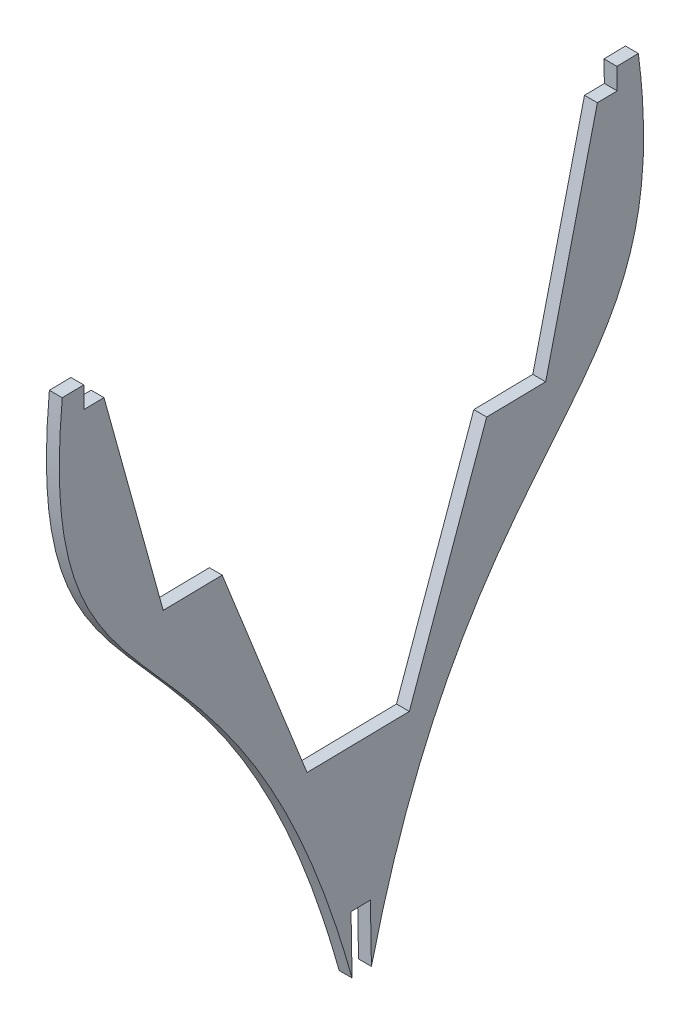
ISO-10303-21;
HEADER;
FILE_DESCRIPTION(('STEP AP214'),'2;1');
FILE_NAME('part.step','',(''),(''),'','','');
FILE_SCHEMA(('AUTOMOTIVE_DESIGN { 1 0 10303 214 1 1 1 1 }'));
ENDSEC;
DATA;
#1=APPLICATION_CONTEXT('core data for automotive mechanical design processes');
#2=APPLICATION_PROTOCOL_DEFINITION('international standard','automotive_design',2000,#1);
#3=PRODUCT_CONTEXT('',#1,'mechanical');
#4=PRODUCT('Part','Part','',(#3));
#5=PRODUCT_RELATED_PRODUCT_CATEGORY('part','',(#4));
#6=PRODUCT_DEFINITION_FORMATION('','',#4);
#7=PRODUCT_DEFINITION_CONTEXT('part definition',#1,'design');
#8=PRODUCT_DEFINITION('design','',#6,#7);
#9=PRODUCT_DEFINITION_SHAPE('','',#8);
#10=(LENGTH_UNIT() NAMED_UNIT(*) SI_UNIT(.MILLI.,.METRE.));
#11=(NAMED_UNIT(*) PLANE_ANGLE_UNIT() SI_UNIT($,.RADIAN.));
#12=(NAMED_UNIT(*) SI_UNIT($,.STERADIAN.) SOLID_ANGLE_UNIT());
#13=UNCERTAINTY_MEASURE_WITH_UNIT(LENGTH_MEASURE(1.E-05),#10,'distance_accuracy_value','');
#14=(GEOMETRIC_REPRESENTATION_CONTEXT(3) GLOBAL_UNCERTAINTY_ASSIGNED_CONTEXT((#13)) GLOBAL_UNIT_ASSIGNED_CONTEXT((#10,
#11,#12)) REPRESENTATION_CONTEXT('',''));
#15=CARTESIAN_POINT('',(0.,0.,0.));
#16=DIRECTION('',(0.,0.,1.));
#17=DIRECTION('',(1.,0.,0.));
#18=AXIS2_PLACEMENT_3D('',#15,#16,#17);
#19=CARTESIAN_POINT('',(6.,360.566258287596,140.41667905477));
#20=CARTESIAN_POINT('',(6.,210.618365196739,154.662503450058));
#21=CARTESIAN_POINT('',(6.,259.198688035919,55.3330933592339));
#22=CARTESIAN_POINT('',(6.,41.0750381859938,0.720131580229417));
#23=B_SPLINE_CURVE_WITH_KNOTS('',3,(#19,#20,#21,#22),.UNSPECIFIED.,.F.,.F.,(4,4),(0.,1.),.UNSPECIFIED.);
#24=DIRECTION('',(-1.,0.,0.));
#25=VECTOR('',#24,1.);
#26=SURFACE_OF_LINEAR_EXTRUSION('',#23,#25);
#27=CARTESIAN_POINT('',(0.,360.566258287596,140.41667905477));
#28=CARTESIAN_POINT('',(0.,210.618365196739,154.662503450058));
#29=CARTESIAN_POINT('',(0.,259.198688035919,55.3330933592339));
#30=CARTESIAN_POINT('',(0.,41.0750381859938,0.720131580229417));
#31=B_SPLINE_CURVE_WITH_KNOTS('',3,(#27,#28,#29,#30),.UNSPECIFIED.,.F.,.F.,(4,4),(0.,1.),.UNSPECIFIED.);
#32=CARTESIAN_POINT('',(0.,360.566258287596,140.41667905477));
#33=VERTEX_POINT('',#32);
#34=CARTESIAN_POINT('',(0.,59.246755687746,5.54010309085406));
#35=VERTEX_POINT('',#34);
#36=EDGE_CURVE('E179',#33,#35,#31,.T.);
#37=ORIENTED_EDGE('',*,*,#36,.T.);
#38=DIRECTION('',(1.,0.,0.));
#39=VECTOR('',#38,1.);
#40=CARTESIAN_POINT('',(0.,59.246755687746,5.54010309085406));
#41=LINE('',#40,#39);
#42=CARTESIAN_POINT('',(6.,59.246755687746,5.54010309085406));
#43=VERTEX_POINT('',#42);
#44=EDGE_CURVE('E185',#35,#43,#41,.T.);
#45=ORIENTED_EDGE('',*,*,#44,.T.);
#46=CARTESIAN_POINT('',(6.,360.566258287596,140.41667905477));
#47=VERTEX_POINT('',#46);
#48=EDGE_CURVE('E219',#47,#43,#23,.T.);
#49=ORIENTED_EDGE('',*,*,#48,.F.);
#50=DIRECTION('',(-1.,0.,0.));
#51=VECTOR('',#50,1.);
#52=CARTESIAN_POINT('',(6.,360.566258287596,140.41667905477));
#53=LINE('',#52,#51);
#54=EDGE_CURVE('E175',#47,#33,#53,.T.);
#55=ORIENTED_EDGE('',*,*,#54,.T.);
#56=EDGE_LOOP('',(#37,#45,#49,#55));
#57=FACE_BOUND('',#56,.T.);
#58=ADVANCED_FACE('F33',(#57),#26,.F.);
#59=CARTESIAN_POINT('',(6.,41.0750381859938,0.720131580229417));
#60=CARTESIAN_POINT('',(6.,260.979009094992,-46.2132871806309));
#61=CARTESIAN_POINT('',(6.,215.910377384876,-147.184559886921));
#62=CARTESIAN_POINT('',(6.,365.266753622569,-127.691303816342));
#63=B_SPLINE_CURVE_WITH_KNOTS('',3,(#59,#60,#61,#62),.UNSPECIFIED.,.F.,.F.,(4,4),(0.,1.),.UNSPECIFIED.);
#64=DIRECTION('',(-1.,0.,0.));
#65=VECTOR('',#64,1.);
#66=SURFACE_OF_LINEAR_EXTRUSION('',#63,#65);
#67=CARTESIAN_POINT('',(6.,59.4045445665467,-3.45989690914594));
#68=VERTEX_POINT('',#67);
#69=CARTESIAN_POINT('',(6.,365.266753622569,-127.691303816342));
#70=VERTEX_POINT('',#69);
#71=EDGE_CURVE('E116',#68,#70,#63,.T.);
#72=ORIENTED_EDGE('',*,*,#71,.F.);
#73=DIRECTION('',(1.,0.,0.));
#74=VECTOR('',#73,1.);
#75=CARTESIAN_POINT('',(0.,59.4045445665467,-3.45989690914594));
#76=LINE('',#75,#74);
#77=CARTESIAN_POINT('',(0.,59.4045445665467,-3.45989690914594));
#78=VERTEX_POINT('',#77);
#79=EDGE_CURVE('E311',#78,#68,#76,.T.);
#80=ORIENTED_EDGE('',*,*,#79,.F.);
#81=CARTESIAN_POINT('',(0.,41.0750381859938,0.720131580229417));
#82=CARTESIAN_POINT('',(0.,260.979009094992,-46.2132871806309));
#83=CARTESIAN_POINT('',(0.,215.910377384876,-147.184559886921));
#84=CARTESIAN_POINT('',(0.,365.266753622569,-127.691303816342));
#85=B_SPLINE_CURVE_WITH_KNOTS('',3,(#81,#82,#83,#84),.UNSPECIFIED.,.F.,.F.,(4,4),(0.,1.),.UNSPECIFIED.);
#86=CARTESIAN_POINT('',(0.,365.266753622569,-127.691303816342));
#87=VERTEX_POINT('',#86);
#88=EDGE_CURVE('E184',#78,#87,#85,.T.);
#89=ORIENTED_EDGE('',*,*,#88,.T.);
#90=DIRECTION('',(-1.,0.,0.));
#91=VECTOR('',#90,1.);
#92=CARTESIAN_POINT('',(6.,365.266753622569,-127.691303816342));
#93=LINE('',#92,#91);
#94=EDGE_CURVE('E11',#70,#87,#93,.T.);
#95=ORIENTED_EDGE('',*,*,#94,.F.);
#96=EDGE_LOOP('',(#72,#80,#89,#95));
#97=FACE_BOUND('',#96,.T.);
#98=ADVANCED_FACE('F323',(#97),#66,.F.);
#99=CARTESIAN_POINT('',(6.,365.266753622569,-127.691303816342));
#100=DIRECTION('',(0.,-0.999846348196663,-0.0175294038061043));
#101=DIRECTION('',(0.,0.0175294038061044,-0.999846348196663));
#102=AXIS2_PLACEMENT_3D('',#99,#100,#101);
#103=PLANE('',#102);
#104=DIRECTION('',(0.,-0.0175294038061044,0.999846348196663));
#105=VECTOR('',#104,1.);
#106=CARTESIAN_POINT('',(0.,365.266753622569,-127.691303816342));
#107=LINE('',#106,#105);
#108=CARTESIAN_POINT('',(0.,365.091432646124,-117.691303816342));
#109=VERTEX_POINT('',#108);
#110=EDGE_CURVE('E192',#87,#109,#107,.T.);
#111=ORIENTED_EDGE('',*,*,#110,.T.);
#112=DIRECTION('',(-1.,0.,0.));
#113=VECTOR('',#112,1.);
#114=CARTESIAN_POINT('',(6.,365.091432646124,-117.691303816342));
#115=LINE('',#114,#113);
#116=CARTESIAN_POINT('',(6.,365.091432646124,-117.691303816342));
#117=VERTEX_POINT('',#116);
#118=EDGE_CURVE('E41',#117,#109,#115,.T.);
#119=ORIENTED_EDGE('',*,*,#118,.F.);
#120=DIRECTION('',(0.,-0.0175294038061044,0.999846348196663));
#121=VECTOR('',#120,1.);
#122=CARTESIAN_POINT('',(6.,365.266753622569,-127.691303816342));
#123=LINE('',#122,#121);
#124=EDGE_CURVE('E305',#70,#117,#123,.T.);
#125=ORIENTED_EDGE('',*,*,#124,.F.);
#126=ORIENTED_EDGE('',*,*,#94,.T.);
#127=EDGE_LOOP('',(#111,#119,#125,#126));
#128=FACE_BOUND('',#127,.T.);
#129=ADVANCED_FACE('F326',(#128),#103,.F.);
#130=CARTESIAN_POINT('',(6.,365.091432646124,-117.691303816342));
#131=DIRECTION('',(0.,0.0175294038061041,-0.999846348196663));
#132=DIRECTION('',(0.,0.999846348196663,0.0175294038061041));
#133=AXIS2_PLACEMENT_3D('',#130,#131,#132);
#134=PLANE('',#133);
#135=DIRECTION('',(0.,-0.999846348196663,-0.0175294038061041));
#136=VECTOR('',#135,1.);
#137=CARTESIAN_POINT('',(0.,365.091432646124,-117.691303816342));
#138=LINE('',#137,#136);
#139=CARTESIAN_POINT('',(0.,355.091432646124,-117.866624792787));
#140=VERTEX_POINT('',#139);
#141=EDGE_CURVE('E197',#109,#140,#138,.T.);
#142=ORIENTED_EDGE('',*,*,#141,.T.);
#143=DIRECTION('',(-1.,0.,0.));
#144=VECTOR('',#143,1.);
#145=CARTESIAN_POINT('',(6.,355.091432646124,-117.866624792787));
#146=LINE('',#145,#144);
#147=CARTESIAN_POINT('',(6.,355.091432646124,-117.866624792787));
#148=VERTEX_POINT('',#147);
#149=EDGE_CURVE('E244',#148,#140,#146,.T.);
#150=ORIENTED_EDGE('',*,*,#149,.F.);
#151=DIRECTION('',(0.,-0.999846348196663,-0.0175294038061041));
#152=VECTOR('',#151,1.);
#153=CARTESIAN_POINT('',(6.,365.091432646124,-117.691303816342));
#154=LINE('',#153,#152);
#155=EDGE_CURVE('E253',#117,#148,#154,.T.);
#156=ORIENTED_EDGE('',*,*,#155,.F.);
#157=ORIENTED_EDGE('',*,*,#118,.T.);
#158=EDGE_LOOP('',(#142,#150,#156,#157));
#159=FACE_BOUND('',#158,.T.);
#160=ADVANCED_FACE('F251',(#159),#134,.F.);
#161=CARTESIAN_POINT('',(6.,355.091432646124,-117.866624792787));
#162=DIRECTION('',(0.,-0.999846348196663,-0.017529403806103));
#163=DIRECTION('',(0.,0.017529403806103,-0.999846348196663));
#164=AXIS2_PLACEMENT_3D('',#161,#162,#163);
#165=PLANE('',#164);
#166=DIRECTION('',(0.,-0.017529403806103,0.999846348196663));
#167=VECTOR('',#166,1.);
#168=CARTESIAN_POINT('',(0.,355.091432646124,-117.866624792787));
#169=LINE('',#168,#167);
#170=CARTESIAN_POINT('',(0.,354.929452332287,-108.627552713607));
#171=VERTEX_POINT('',#170);
#172=EDGE_CURVE('E199',#140,#171,#169,.T.);
#173=ORIENTED_EDGE('',*,*,#172,.T.);
#174=DIRECTION('',(-1.,0.,0.));
#175=VECTOR('',#174,1.);
#176=CARTESIAN_POINT('',(6.,354.929452332287,-108.627552713607));
#177=LINE('',#176,#175);
#178=CARTESIAN_POINT('',(6.,354.929452332287,-108.627552713607));
#179=VERTEX_POINT('',#178);
#180=EDGE_CURVE('E241',#179,#171,#177,.T.);
#181=ORIENTED_EDGE('',*,*,#180,.F.);
#182=DIRECTION('',(0.,-0.017529403806103,0.999846348196663));
#183=VECTOR('',#182,1.);
#184=CARTESIAN_POINT('',(6.,355.091432646124,-117.866624792787));
#185=LINE('',#184,#183);
#186=EDGE_CURVE('E275',#148,#179,#185,.T.);
#187=ORIENTED_EDGE('',*,*,#186,.F.);
#188=ORIENTED_EDGE('',*,*,#149,.T.);
#189=EDGE_LOOP('',(#173,#181,#187,#188));
#190=FACE_BOUND('',#189,.T.);
#191=ADVANCED_FACE('F266',(#190),#165,.F.);
#192=CARTESIAN_POINT('',(6.,354.929452332287,-108.627552713607));
#193=DIRECTION('',(0.,-0.232987196672777,-0.972479802456874));
#194=DIRECTION('',(0.,0.972479802456874,-0.232987196672777));
#195=AXIS2_PLACEMENT_3D('',#192,#193,#194);
#196=PLANE('',#195);
#197=DIRECTION('',(0.,-0.972479802456874,0.232987196672777));
#198=VECTOR('',#197,1.);
#199=CARTESIAN_POINT('',(0.,354.929452332287,-108.627552713607));
#200=LINE('',#199,#198);
#201=CARTESIAN_POINT('',(0.,254.492213363747,-84.5647488489771));
#202=VERTEX_POINT('',#201);
#203=EDGE_CURVE('E201',#171,#202,#200,.T.);
#204=ORIENTED_EDGE('',*,*,#203,.T.);
#205=DIRECTION('',(-1.,0.,0.));
#206=VECTOR('',#205,1.);
#207=CARTESIAN_POINT('',(6.,254.492213363747,-84.5647488489771));
#208=LINE('',#207,#206);
#209=CARTESIAN_POINT('',(6.,254.492213363747,-84.5647488489771));
#210=VERTEX_POINT('',#209);
#211=EDGE_CURVE('E238',#210,#202,#208,.T.);
#212=ORIENTED_EDGE('',*,*,#211,.F.);
#213=DIRECTION('',(0.,-0.972479802456874,0.232987196672777));
#214=VECTOR('',#213,1.);
#215=CARTESIAN_POINT('',(6.,354.929452332287,-108.627552713607));
#216=LINE('',#215,#214);
#217=EDGE_CURVE('E272',#179,#210,#216,.T.);
#218=ORIENTED_EDGE('',*,*,#217,.F.);
#219=ORIENTED_EDGE('',*,*,#180,.T.);
#220=EDGE_LOOP('',(#204,#212,#218,#219));
#221=FACE_BOUND('',#220,.T.);
#222=ADVANCED_FACE('F270',(#221),#196,.F.);
#223=CARTESIAN_POINT('',(6.,254.492213363747,-84.5647488489771));
#224=DIRECTION('',(0.,-0.999846348196663,-0.0175294038061057));
#225=DIRECTION('',(0.,0.0175294038061057,-0.999846348196663));
#226=AXIS2_PLACEMENT_3D('',#223,#224,#225);
#227=PLANE('',#226);
#228=DIRECTION('',(0.,-0.0175294038061057,0.999846348196663));
#229=VECTOR('',#228,1.);
#230=CARTESIAN_POINT('',(0.,254.492213363747,-84.5647488489771));
#231=LINE('',#230,#229);
#232=CARTESIAN_POINT('',(0.,254.010909469662,-57.1120216372243));
#233=VERTEX_POINT('',#232);
#234=EDGE_CURVE('E203',#202,#233,#231,.T.);
#235=ORIENTED_EDGE('',*,*,#234,.T.);
#236=DIRECTION('',(-1.,0.,0.));
#237=VECTOR('',#236,1.);
#238=CARTESIAN_POINT('',(6.,254.010909469662,-57.1120216372243));
#239=LINE('',#238,#237);
#240=CARTESIAN_POINT('',(6.,254.010909469662,-57.1120216372243));
#241=VERTEX_POINT('',#240);
#242=EDGE_CURVE('E235',#241,#233,#239,.T.);
#243=ORIENTED_EDGE('',*,*,#242,.F.);
#244=DIRECTION('',(0.,-0.0175294038061057,0.999846348196663));
#245=VECTOR('',#244,1.);
#246=CARTESIAN_POINT('',(6.,254.492213363747,-84.5647488489771));
#247=LINE('',#246,#245);
#248=EDGE_CURVE('E274',#210,#241,#247,.T.);
#249=ORIENTED_EDGE('',*,*,#248,.F.);
#250=ORIENTED_EDGE('',*,*,#211,.T.);
#251=EDGE_LOOP('',(#235,#243,#249,#250));
#252=FACE_BOUND('',#251,.T.);
#253=ADVANCED_FACE('F336',(#252),#227,.F.);
#254=CARTESIAN_POINT('',(6.,254.010909469662,-57.1120216372243));
#255=DIRECTION('',(0.,-0.336739007882054,-0.941598024939841));
#256=DIRECTION('',(0.,0.941598024939841,-0.336739007882054));
#257=AXIS2_PLACEMENT_3D('',#254,#255,#256);
#258=PLANE('',#257);
#259=DIRECTION('',(0.,-0.941598024939841,0.336739007882054));
#260=VECTOR('',#259,1.);
#261=CARTESIAN_POINT('',(0.,254.010909469662,-57.1120216372243));
#262=LINE('',#261,#260);
#263=CARTESIAN_POINT('',(0.,153.364497309212,-21.1183469691368));
#264=VERTEX_POINT('',#263);
#265=EDGE_CURVE('E205',#233,#264,#262,.T.);
#266=ORIENTED_EDGE('',*,*,#265,.T.);
#267=DIRECTION('',(-1.,0.,0.));
#268=VECTOR('',#267,1.);
#269=CARTESIAN_POINT('',(6.,153.364497309212,-21.1183469691368));
#270=LINE('',#269,#268);
#271=CARTESIAN_POINT('',(6.,153.364497309212,-21.1183469691368));
#272=VERTEX_POINT('',#271);
#273=EDGE_CURVE('E232',#272,#264,#270,.T.);
#274=ORIENTED_EDGE('',*,*,#273,.F.);
#275=DIRECTION('',(0.,-0.941598024939841,0.336739007882054));
#276=VECTOR('',#275,1.);
#277=CARTESIAN_POINT('',(6.,254.010909469662,-57.1120216372243));
#278=LINE('',#277,#276);
#279=EDGE_CURVE('E277',#241,#272,#278,.T.);
#280=ORIENTED_EDGE('',*,*,#279,.F.);
#281=ORIENTED_EDGE('',*,*,#242,.T.);
#282=EDGE_LOOP('',(#266,#274,#280,#281));
#283=FACE_BOUND('',#282,.T.);
#284=ADVANCED_FACE('F339',(#283),#258,.F.);
#285=CARTESIAN_POINT('',(6.,152.529975322288,26.4813187322326));
#286=DIRECTION('',(0.,-0.999846348196663,-0.0175294038061051));
#287=DIRECTION('',(0.,0.0175294038061051,-0.999846348196663));
#288=AXIS2_PLACEMENT_3D('',#285,#286,#287);
#289=PLANE('',#288);
#290=DIRECTION('',(0.,-0.0175294038061051,0.999846348196663));
#291=VECTOR('',#290,1.);
#292=CARTESIAN_POINT('',(0.,152.529975322288,26.4813187322326));
#293=LINE('',#292,#291);
#294=CARTESIAN_POINT('',(0.,152.529975322288,26.4813187322326));
#295=VERTEX_POINT('',#294);
#296=EDGE_CURVE('E207',#264,#295,#293,.T.);
#297=ORIENTED_EDGE('',*,*,#296,.T.);
#298=DIRECTION('',(-1.,0.,0.));
#299=VECTOR('',#298,1.);
#300=CARTESIAN_POINT('',(6.,152.529975322288,26.4813187322326));
#301=LINE('',#300,#299);
#302=CARTESIAN_POINT('',(6.,152.529975322288,26.4813187322326));
#303=VERTEX_POINT('',#302);
#304=EDGE_CURVE('E229',#303,#295,#301,.T.);
#305=ORIENTED_EDGE('',*,*,#304,.F.);
#306=DIRECTION('',(0.,-0.0175294038061051,0.999846348196663));
#307=VECTOR('',#306,1.);
#308=CARTESIAN_POINT('',(6.,152.529975322288,26.4813187322326));
#309=LINE('',#308,#307);
#310=EDGE_CURVE('E283',#272,#303,#309,.T.);
#311=ORIENTED_EDGE('',*,*,#310,.F.);
#312=ORIENTED_EDGE('',*,*,#273,.T.);
#313=EDGE_LOOP('',(#297,#305,#311,#312));
#314=FACE_BOUND('',#313,.T.);
#315=ADVANCED_FACE('F343',(#314),#289,.F.);
#316=CARTESIAN_POINT('',(6.,251.852832801171,65.9808741615411));
#317=DIRECTION('',(0.,-0.369538293316866,0.92921550233111));
#318=DIRECTION('',(0.,-0.92921550233111,-0.369538293316866));
#319=AXIS2_PLACEMENT_3D('',#316,#317,#318);
#320=PLANE('',#319);
#321=DIRECTION('',(0.,0.92921550233111,0.369538293316866));
#322=VECTOR('',#321,1.);
#323=CARTESIAN_POINT('',(0.,251.852832801171,65.9808741615411));
#324=LINE('',#323,#322);
#325=CARTESIAN_POINT('',(0.,251.852832801171,65.9808741615411));
#326=VERTEX_POINT('',#325);
#327=EDGE_CURVE('E209',#295,#326,#324,.T.);
#328=ORIENTED_EDGE('',*,*,#327,.T.);
#329=DIRECTION('',(-1.,0.,0.));
#330=VECTOR('',#329,1.);
#331=CARTESIAN_POINT('',(6.,251.852832801171,65.9808741615411));
#332=LINE('',#331,#330);
#333=CARTESIAN_POINT('',(6.,251.852832801171,65.9808741615411));
#334=VERTEX_POINT('',#333);
#335=EDGE_CURVE('E226',#334,#326,#332,.T.);
#336=ORIENTED_EDGE('',*,*,#335,.F.);
#337=DIRECTION('',(0.,0.92921550233111,0.369538293316866));
#338=VECTOR('',#337,1.);
#339=CARTESIAN_POINT('',(6.,251.852832801171,65.9808741615411));
#340=LINE('',#339,#338);
#341=EDGE_CURVE('E285',#303,#334,#340,.T.);
#342=ORIENTED_EDGE('',*,*,#341,.F.);
#343=ORIENTED_EDGE('',*,*,#304,.T.);
#344=EDGE_LOOP('',(#328,#336,#342,#343));
#345=FACE_BOUND('',#344,.T.);
#346=ADVANCED_FACE('F347',(#345),#320,.F.);
#347=CARTESIAN_POINT('',(6.,251.371528907086,93.433601373294));
#348=DIRECTION('',(0.,-0.999846348196663,-0.0175294038061057));
#349=DIRECTION('',(0.,0.0175294038061057,-0.999846348196663));
#350=AXIS2_PLACEMENT_3D('',#347,#348,#349);
#351=PLANE('',#350);
#352=DIRECTION('',(0.,-0.0175294038061057,0.999846348196663));
#353=VECTOR('',#352,1.);
#354=CARTESIAN_POINT('',(0.,251.371528907086,93.433601373294));
#355=LINE('',#354,#353);
#356=CARTESIAN_POINT('',(0.,251.371528907086,93.433601373294));
#357=VERTEX_POINT('',#356);
#358=EDGE_CURVE('E211',#326,#357,#355,.T.);
#359=ORIENTED_EDGE('',*,*,#358,.T.);
#360=DIRECTION('',(-1.,0.,0.));
#361=VECTOR('',#360,1.);
#362=CARTESIAN_POINT('',(6.,251.371528907086,93.433601373294));
#363=LINE('',#362,#361);
#364=CARTESIAN_POINT('',(6.,251.371528907086,93.433601373294));
#365=VERTEX_POINT('',#364);
#366=EDGE_CURVE('E223',#365,#357,#363,.T.);
#367=ORIENTED_EDGE('',*,*,#366,.F.);
#368=DIRECTION('',(0.,-0.0175294038061057,0.999846348196663));
#369=VECTOR('',#368,1.);
#370=CARTESIAN_POINT('',(6.,251.371528907086,93.433601373294));
#371=LINE('',#370,#369);
#372=EDGE_CURVE('E287',#334,#365,#371,.T.);
#373=ORIENTED_EDGE('',*,*,#372,.F.);
#374=ORIENTED_EDGE('',*,*,#335,.T.);
#375=EDGE_LOOP('',(#359,#367,#373,#374));
#376=FACE_BOUND('',#375,.T.);
#377=ADVANCED_FACE('F293',(#376),#351,.F.);
#378=CARTESIAN_POINT('',(6.,350.903559577878,121.002285999145));
#379=DIRECTION('',(0.,-0.266932755761448,0.963715157036351));
#380=DIRECTION('',(0.,-0.963715157036351,-0.266932755761448));
#381=AXIS2_PLACEMENT_3D('',#378,#379,#380);
#382=PLANE('',#381);
#383=DIRECTION('',(0.,0.963715157036351,0.266932755761448));
#384=VECTOR('',#383,1.);
#385=CARTESIAN_POINT('',(0.,350.903559577878,121.002285999145));
#386=LINE('',#385,#384);
#387=CARTESIAN_POINT('',(0.,350.903559577878,121.002285999145));
#388=VERTEX_POINT('',#387);
#389=EDGE_CURVE('E213',#357,#388,#386,.T.);
#390=ORIENTED_EDGE('',*,*,#389,.T.);
#391=DIRECTION('',(-1.,0.,0.));
#392=VECTOR('',#391,1.);
#393=CARTESIAN_POINT('',(6.,350.903559577878,121.002285999145));
#394=LINE('',#393,#392);
#395=CARTESIAN_POINT('',(6.,350.903559577878,121.002285999145));
#396=VERTEX_POINT('',#395);
#397=EDGE_CURVE('E170',#396,#388,#394,.T.);
#398=ORIENTED_EDGE('',*,*,#397,.F.);
#399=DIRECTION('',(0.,0.963715157036351,0.266932755761448));
#400=VECTOR('',#399,1.);
#401=CARTESIAN_POINT('',(6.,350.903559577878,121.002285999145));
#402=LINE('',#401,#400);
#403=EDGE_CURVE('E158',#365,#396,#402,.T.);
#404=ORIENTED_EDGE('',*,*,#403,.F.);
#405=ORIENTED_EDGE('',*,*,#366,.T.);
#406=EDGE_LOOP('',(#390,#398,#404,#405));
#407=FACE_BOUND('',#406,.T.);
#408=ADVANCED_FACE('F297',(#407),#382,.F.);
#409=CARTESIAN_POINT('',(6.,350.741579264041,130.241358078325));
#410=DIRECTION('',(0.,-0.999846348196663,-0.017529403806103));
#411=DIRECTION('',(0.,0.017529403806103,-0.999846348196663));
#412=AXIS2_PLACEMENT_3D('',#409,#410,#411);
#413=PLANE('',#412);
#414=DIRECTION('',(0.,-0.017529403806103,0.999846348196663));
#415=VECTOR('',#414,1.);
#416=CARTESIAN_POINT('',(0.,350.741579264041,130.241358078325));
#417=LINE('',#416,#415);
#418=CARTESIAN_POINT('',(0.,350.741579264041,130.241358078325));
#419=VERTEX_POINT('',#418);
#420=EDGE_CURVE('E167',#388,#419,#417,.T.);
#421=ORIENTED_EDGE('',*,*,#420,.T.);
#422=DIRECTION('',(-1.,0.,0.));
#423=VECTOR('',#422,1.);
#424=CARTESIAN_POINT('',(6.,350.741579264041,130.241358078325));
#425=LINE('',#424,#423);
#426=CARTESIAN_POINT('',(6.,350.741579264041,130.241358078325));
#427=VERTEX_POINT('',#426);
#428=EDGE_CURVE('E164',#427,#419,#425,.T.);
#429=ORIENTED_EDGE('',*,*,#428,.F.);
#430=DIRECTION('',(0.,-0.017529403806103,0.999846348196663));
#431=VECTOR('',#430,1.);
#432=CARTESIAN_POINT('',(6.,350.741579264041,130.241358078325));
#433=LINE('',#432,#431);
#434=EDGE_CURVE('E151',#396,#427,#433,.T.);
#435=ORIENTED_EDGE('',*,*,#434,.F.);
#436=ORIENTED_EDGE('',*,*,#397,.T.);
#437=EDGE_LOOP('',(#421,#429,#435,#436));
#438=FACE_BOUND('',#437,.T.);
#439=ADVANCED_FACE('F165',(#438),#413,.F.);
#440=CARTESIAN_POINT('',(6.,360.741579264041,130.41667905477));
#441=DIRECTION('',(0.,-0.0175294038061071,0.999846348196663));
#442=DIRECTION('',(0.,-0.999846348196663,-0.0175294038061071));
#443=AXIS2_PLACEMENT_3D('',#440,#441,#442);
#444=PLANE('',#443);
#445=DIRECTION('',(0.,0.999846348196663,0.0175294038061071));
#446=VECTOR('',#445,1.);
#447=CARTESIAN_POINT('',(0.,360.741579264041,130.41667905477));
#448=LINE('',#447,#446);
#449=CARTESIAN_POINT('',(0.,360.741579264041,130.41667905477));
#450=VERTEX_POINT('',#449);
#451=EDGE_CURVE('E216',#419,#450,#448,.T.);
#452=ORIENTED_EDGE('',*,*,#451,.T.);
#453=DIRECTION('',(-1.,0.,0.));
#454=VECTOR('',#453,1.);
#455=CARTESIAN_POINT('',(6.,360.741579264041,130.41667905477));
#456=LINE('',#455,#454);
#457=CARTESIAN_POINT('',(6.,360.741579264041,130.41667905477));
#458=VERTEX_POINT('',#457);
#459=EDGE_CURVE('E171',#458,#450,#456,.T.);
#460=ORIENTED_EDGE('',*,*,#459,.F.);
#461=DIRECTION('',(0.,0.999846348196663,0.0175294038061071));
#462=VECTOR('',#461,1.);
#463=CARTESIAN_POINT('',(6.,360.741579264041,130.41667905477));
#464=LINE('',#463,#462);
#465=EDGE_CURVE('E155',#427,#458,#464,.T.);
#466=ORIENTED_EDGE('',*,*,#465,.F.);
#467=ORIENTED_EDGE('',*,*,#428,.T.);
#468=EDGE_LOOP('',(#452,#460,#466,#467));
#469=FACE_BOUND('',#468,.T.);
#470=ADVANCED_FACE('F173',(#469),#444,.F.);
#471=CARTESIAN_POINT('',(6.,360.566258287596,140.41667905477));
#472=DIRECTION('',(0.,-0.999846348196663,-0.0175294038061043));
#473=DIRECTION('',(0.,0.0175294038061043,-0.999846348196663));
#474=AXIS2_PLACEMENT_3D('',#471,#472,#473);
#475=PLANE('',#474);
#476=DIRECTION('',(0.,-0.0175294038061043,0.999846348196663));
#477=VECTOR('',#476,1.);
#478=CARTESIAN_POINT('',(0.,360.566258287596,140.41667905477));
#479=LINE('',#478,#477);
#480=EDGE_CURVE('E108',#450,#33,#479,.T.);
#481=ORIENTED_EDGE('',*,*,#480,.T.);
#482=ORIENTED_EDGE('',*,*,#54,.F.);
#483=DIRECTION('',(0.,-0.0175294038061043,0.999846348196663));
#484=VECTOR('',#483,1.);
#485=CARTESIAN_POINT('',(6.,360.566258287596,140.41667905477));
#486=LINE('',#485,#484);
#487=EDGE_CURVE('E57',#458,#47,#486,.T.);
#488=ORIENTED_EDGE('',*,*,#487,.F.);
#489=ORIENTED_EDGE('',*,*,#459,.T.);
#490=EDGE_LOOP('',(#481,#482,#488,#489));
#491=FACE_BOUND('',#490,.T.);
#492=ADVANCED_FACE('F299',(#491),#475,.F.);
#493=CARTESIAN_POINT('',(6.,226.386557021445,96.3904501328593));
#494=DIRECTION('',(-1.,0.,0.));
#495=DIRECTION('',(0.,0.,1.));
#496=AXIS2_PLACEMENT_3D('',#493,#494,#495);
#497=PLANE('',#496);
#498=ORIENTED_EDGE('',*,*,#48,.T.);
#499=DIRECTION('',(0.,-0.999846348196663,-0.0175294038061052));
#500=VECTOR('',#499,1.);
#501=CARTESIAN_POINT('',(6.,59.246755687746,5.54010309085406));
#502=LINE('',#501,#500);
#503=CARTESIAN_POINT('',(6.,86.246755687746,6.01346972725622));
#504=VERTEX_POINT('',#503);
#505=EDGE_CURVE('E499',#504,#43,#502,.T.);
#506=ORIENTED_EDGE('',*,*,#505,.F.);
#507=DIRECTION('',(0.,-0.0175294038061049,0.999846348196663));
#508=VECTOR('',#507,1.);
#509=CARTESIAN_POINT('',(6.,86.246755687746,6.01346972725622));
#510=LINE('',#509,#508);
#511=CARTESIAN_POINT('',(6.,86.4045445665467,-2.98653027274378));
#512=VERTEX_POINT('',#511);
#513=EDGE_CURVE('E507',#512,#504,#510,.T.);
#514=ORIENTED_EDGE('',*,*,#513,.F.);
#515=DIRECTION('',(0.,0.999846348196663,0.0175294038061053));
#516=VECTOR('',#515,1.);
#517=CARTESIAN_POINT('',(6.,86.4045445665467,-2.98653027274378));
#518=LINE('',#517,#516);
#519=EDGE_CURVE('E511',#68,#512,#518,.T.);
#520=ORIENTED_EDGE('',*,*,#519,.F.);
#521=ORIENTED_EDGE('',*,*,#71,.T.);
#522=ORIENTED_EDGE('',*,*,#124,.T.);
#523=ORIENTED_EDGE('',*,*,#155,.T.);
#524=ORIENTED_EDGE('',*,*,#186,.T.);
#525=ORIENTED_EDGE('',*,*,#217,.T.);
#526=ORIENTED_EDGE('',*,*,#248,.T.);
#527=ORIENTED_EDGE('',*,*,#279,.T.);
#528=ORIENTED_EDGE('',*,*,#310,.T.);
#529=ORIENTED_EDGE('',*,*,#341,.T.);
#530=ORIENTED_EDGE('',*,*,#372,.T.);
#531=ORIENTED_EDGE('',*,*,#403,.T.);
#532=ORIENTED_EDGE('',*,*,#434,.T.);
#533=ORIENTED_EDGE('',*,*,#465,.T.);
#534=ORIENTED_EDGE('',*,*,#487,.T.);
#535=EDGE_LOOP('',(#498,#506,#514,#520,#521,#522,#523,#524,#525,#526,#527,#528,#529,#530,#531,
#532,#533,#534));
#536=FACE_BOUND('',#535,.T.);
#537=ADVANCED_FACE('F153',(#536),#497,.F.);
#538=CARTESIAN_POINT('',(0.,226.386557021445,96.3904501328593));
#539=DIRECTION('',(-1.,0.,0.));
#540=DIRECTION('',(0.,0.,1.));
#541=AXIS2_PLACEMENT_3D('',#538,#539,#540);
#542=PLANE('',#541);
#543=DIRECTION('',(0.,-0.999846348196663,-0.0175294038061052));
#544=VECTOR('',#543,1.);
#545=CARTESIAN_POINT('',(0.,59.246755687746,5.54010309085406));
#546=LINE('',#545,#544);
#547=CARTESIAN_POINT('',(0.,86.246755687746,6.01346972725622));
#548=VERTEX_POINT('',#547);
#549=EDGE_CURVE('E520',#548,#35,#546,.T.);
#550=ORIENTED_EDGE('',*,*,#549,.T.);
#551=ORIENTED_EDGE('',*,*,#36,.F.);
#552=ORIENTED_EDGE('',*,*,#480,.F.);
#553=ORIENTED_EDGE('',*,*,#451,.F.);
#554=ORIENTED_EDGE('',*,*,#420,.F.);
#555=ORIENTED_EDGE('',*,*,#389,.F.);
#556=ORIENTED_EDGE('',*,*,#358,.F.);
#557=ORIENTED_EDGE('',*,*,#327,.F.);
#558=ORIENTED_EDGE('',*,*,#296,.F.);
#559=ORIENTED_EDGE('',*,*,#265,.F.);
#560=ORIENTED_EDGE('',*,*,#234,.F.);
#561=ORIENTED_EDGE('',*,*,#203,.F.);
#562=ORIENTED_EDGE('',*,*,#172,.F.);
#563=ORIENTED_EDGE('',*,*,#141,.F.);
#564=ORIENTED_EDGE('',*,*,#110,.F.);
#565=ORIENTED_EDGE('',*,*,#88,.F.);
#566=DIRECTION('',(0.,0.999846348196663,0.0175294038061053));
#567=VECTOR('',#566,1.);
#568=CARTESIAN_POINT('',(0.,86.4045445665467,-2.98653027274378));
#569=LINE('',#568,#567);
#570=CARTESIAN_POINT('',(0.,86.4045445665467,-2.98653027274379));
#571=VERTEX_POINT('',#570);
#572=EDGE_CURVE('E506',#78,#571,#569,.T.);
#573=ORIENTED_EDGE('',*,*,#572,.T.);
#574=DIRECTION('',(0.,-0.0175294038061049,0.999846348196663));
#575=VECTOR('',#574,1.);
#576=CARTESIAN_POINT('',(0.,86.246755687746,6.01346972725622));
#577=LINE('',#576,#575);
#578=EDGE_CURVE('E48',#571,#548,#577,.T.);
#579=ORIENTED_EDGE('',*,*,#578,.T.);
#580=EDGE_LOOP('',(#550,#551,#552,#553,#554,#555,#556,#557,#558,#559,#560,#561,#562,#563,#564,
#565,#573,#579));
#581=FACE_BOUND('',#580,.T.);
#582=ADVANCED_FACE('F260',(#581),#542,.T.);
#583=CARTESIAN_POINT('',(0.,59.246755687746,5.54010309085406));
#584=DIRECTION('',(0.,-0.0175294038061052,0.999846348196663));
#585=DIRECTION('',(0.,-0.999846348196663,-0.0175294038061052));
#586=AXIS2_PLACEMENT_3D('',#583,#584,#585);
#587=PLANE('',#586);
#588=ORIENTED_EDGE('',*,*,#505,.T.);
#589=ORIENTED_EDGE('',*,*,#44,.F.);
#590=ORIENTED_EDGE('',*,*,#549,.F.);
#591=DIRECTION('',(1.,0.,0.));
#592=VECTOR('',#591,1.);
#593=CARTESIAN_POINT('',(0.,86.246755687746,6.01346972725622));
#594=LINE('',#593,#592);
#595=EDGE_CURVE('E502',#548,#504,#594,.T.);
#596=ORIENTED_EDGE('',*,*,#595,.T.);
#597=EDGE_LOOP('',(#588,#589,#590,#596));
#598=FACE_BOUND('',#597,.T.);
#599=ADVANCED_FACE('F364',(#598),#587,.F.);
#600=CARTESIAN_POINT('',(0.,86.246755687746,6.01346972725622));
#601=DIRECTION('',(0.,0.999846348196663,0.0175294038061049));
#602=DIRECTION('',(0.,-0.0175294038061049,0.999846348196663));
#603=AXIS2_PLACEMENT_3D('',#600,#601,#602);
#604=PLANE('',#603);
#605=ORIENTED_EDGE('',*,*,#513,.T.);
#606=ORIENTED_EDGE('',*,*,#595,.F.);
#607=ORIENTED_EDGE('',*,*,#578,.F.);
#608=DIRECTION('',(1.,0.,0.));
#609=VECTOR('',#608,1.);
#610=CARTESIAN_POINT('',(0.,86.4045445665467,-2.98653027274378));
#611=LINE('',#610,#609);
#612=EDGE_CURVE('E516',#571,#512,#611,.T.);
#613=ORIENTED_EDGE('',*,*,#612,.T.);
#614=EDGE_LOOP('',(#605,#606,#607,#613));
#615=FACE_BOUND('',#614,.T.);
#616=ADVANCED_FACE('F370',(#615),#604,.F.);
#617=CARTESIAN_POINT('',(0.,86.4045445665467,-2.98653027274378));
#618=DIRECTION('',(0.,0.0175294038061053,-0.999846348196663));
#619=DIRECTION('',(0.,0.999846348196663,0.0175294038061053));
#620=AXIS2_PLACEMENT_3D('',#617,#618,#619);
#621=PLANE('',#620);
#622=ORIENTED_EDGE('',*,*,#519,.T.);
#623=ORIENTED_EDGE('',*,*,#612,.F.);
#624=ORIENTED_EDGE('',*,*,#572,.F.);
#625=ORIENTED_EDGE('',*,*,#79,.T.);
#626=EDGE_LOOP('',(#622,#623,#624,#625));
#627=FACE_BOUND('',#626,.T.);
#628=ADVANCED_FACE('F367',(#627),#621,.F.);
#629=CLOSED_SHELL('',(#58,#98,#129,#160,#191,#222,#253,#284,#315,#346,#377,#408,#439,#470,#492,
#537,#582,#599,#616,#628));
#630=MANIFOLD_SOLID_BREP('B2',#629);
#631=ADVANCED_BREP_SHAPE_REPRESENTATION('',(#18,#630),#14);
#632=SHAPE_DEFINITION_REPRESENTATION(#9,#631);
ENDSEC;
END-ISO-10303-21;
